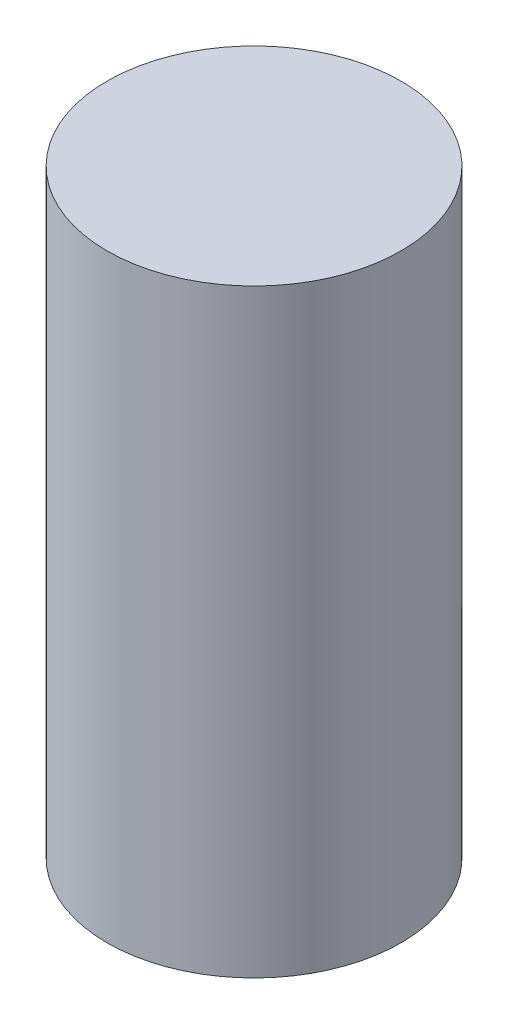
ISO-10303-21;
HEADER;
FILE_DESCRIPTION(('STEP AP214'),'2;1');
FILE_NAME('part.step','',(''),(''),'','','');
FILE_SCHEMA(('AUTOMOTIVE_DESIGN { 1 0 10303 214 1 1 1 1 }'));
ENDSEC;
DATA;
#1=APPLICATION_CONTEXT('core data for automotive mechanical design processes');
#2=APPLICATION_PROTOCOL_DEFINITION('international standard','automotive_design',2000,#1);
#3=PRODUCT_CONTEXT('',#1,'mechanical');
#4=PRODUCT('Part','Part','',(#3));
#5=PRODUCT_RELATED_PRODUCT_CATEGORY('part','',(#4));
#6=PRODUCT_DEFINITION_FORMATION('','',#4);
#7=PRODUCT_DEFINITION_CONTEXT('part definition',#1,'design');
#8=PRODUCT_DEFINITION('design','',#6,#7);
#9=PRODUCT_DEFINITION_SHAPE('','',#8);
#10=(LENGTH_UNIT() NAMED_UNIT(*) SI_UNIT(.MILLI.,.METRE.));
#11=(NAMED_UNIT(*) PLANE_ANGLE_UNIT() SI_UNIT($,.RADIAN.));
#12=(NAMED_UNIT(*) SI_UNIT($,.STERADIAN.) SOLID_ANGLE_UNIT());
#13=UNCERTAINTY_MEASURE_WITH_UNIT(LENGTH_MEASURE(1.E-05),#10,'distance_accuracy_value','');
#14=(GEOMETRIC_REPRESENTATION_CONTEXT(3) GLOBAL_UNCERTAINTY_ASSIGNED_CONTEXT((#13)) GLOBAL_UNIT_ASSIGNED_CONTEXT((#10,
#11,#12)) REPRESENTATION_CONTEXT('',''));
#15=CARTESIAN_POINT('',(0.,0.,0.));
#16=DIRECTION('',(0.,0.,1.));
#17=DIRECTION('',(1.,0.,0.));
#18=AXIS2_PLACEMENT_3D('',#15,#16,#17);
#19=CARTESIAN_POINT('',(0.,300.,0.));
#20=DIRECTION('',(0.,-1.,0.));
#21=DIRECTION('',(0.,0.,-1.));
#22=AXIS2_PLACEMENT_3D('',#19,#20,#21);
#23=CYLINDRICAL_SURFACE('',#22,73.61);
#24=CARTESIAN_POINT('',(0.,300.,0.));
#25=DIRECTION('',(0.,1.,0.));
#26=DIRECTION('',(0.,0.,1.));
#27=AXIS2_PLACEMENT_3D('',#24,#25,#26);
#28=CIRCLE('',#27,73.61);
#29=CARTESIAN_POINT('',(0.,300.,73.61));
#30=VERTEX_POINT('',#29);
#31=EDGE_CURVE('E10',#30,#30,#28,.T.);
#32=ORIENTED_EDGE('',*,*,#31,.F.);
#33=EDGE_LOOP('',(#32));
#34=FACE_BOUND('',#33,.T.);
#35=CARTESIAN_POINT('',(0.,0.,0.));
#36=DIRECTION('',(0.,1.,0.));
#37=DIRECTION('',(0.,0.,1.));
#38=AXIS2_PLACEMENT_3D('',#35,#36,#37);
#39=CIRCLE('',#38,73.61);
#40=CARTESIAN_POINT('',(0.,0.,73.61));
#41=VERTEX_POINT('',#40);
#42=EDGE_CURVE('E34',#41,#41,#39,.T.);
#43=ORIENTED_EDGE('',*,*,#42,.T.);
#44=EDGE_LOOP('',(#43));
#45=FACE_BOUND('',#44,.T.);
#46=ADVANCED_FACE('F31',(#34,#45),#23,.T.);
#47=CARTESIAN_POINT('',(0.,300.,0.));
#48=DIRECTION('',(0.,1.,0.));
#49=DIRECTION('',(0.,0.,1.));
#50=AXIS2_PLACEMENT_3D('',#47,#48,#49);
#51=PLANE('',#50);
#52=ORIENTED_EDGE('',*,*,#31,.T.);
#53=EDGE_LOOP('',(#52));
#54=FACE_BOUND('',#53,.T.);
#55=ADVANCED_FACE('F46',(#54),#51,.T.);
#56=CARTESIAN_POINT('',(0.,0.,0.));
#57=DIRECTION('',(0.,1.,0.));
#58=DIRECTION('',(0.,0.,1.));
#59=AXIS2_PLACEMENT_3D('',#56,#57,#58);
#60=PLANE('',#59);
#61=ORIENTED_EDGE('',*,*,#42,.F.);
#62=EDGE_LOOP('',(#61));
#63=FACE_BOUND('',#62,.T.);
#64=ADVANCED_FACE('F44',(#63),#60,.F.);
#65=CLOSED_SHELL('',(#46,#55,#64));
#66=MANIFOLD_SOLID_BREP('B2',#65);
#67=ADVANCED_BREP_SHAPE_REPRESENTATION('',(#18,#66),#14);
#68=SHAPE_DEFINITION_REPRESENTATION(#9,#67);
ENDSEC;
END-ISO-10303-21;
